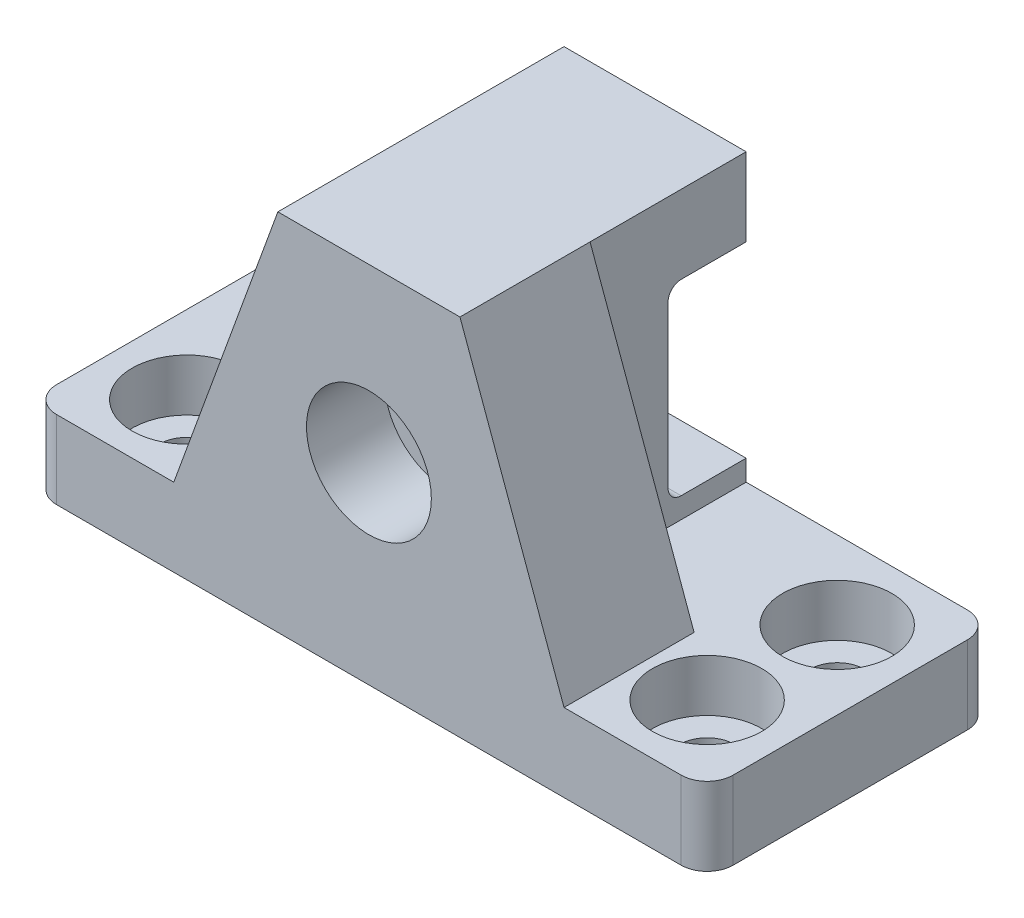
ISO-10303-21;
HEADER;
FILE_DESCRIPTION(('STEP AP214'),'2;1');
FILE_NAME('part.step','',(''),(''),'','','');
FILE_SCHEMA(('AUTOMOTIVE_DESIGN { 1 0 10303 214 1 1 1 1 }'));
ENDSEC;
DATA;
#1=APPLICATION_CONTEXT('core data for automotive mechanical design processes');
#2=APPLICATION_PROTOCOL_DEFINITION('international standard','automotive_design',2000,#1);
#3=PRODUCT_CONTEXT('',#1,'mechanical');
#4=PRODUCT('Part','Part','',(#3));
#5=PRODUCT_RELATED_PRODUCT_CATEGORY('part','',(#4));
#6=PRODUCT_DEFINITION_FORMATION('','',#4);
#7=PRODUCT_DEFINITION_CONTEXT('part definition',#1,'design');
#8=PRODUCT_DEFINITION('design','',#6,#7);
#9=PRODUCT_DEFINITION_SHAPE('','',#8);
#10=(LENGTH_UNIT() NAMED_UNIT(*) SI_UNIT(.MILLI.,.METRE.));
#11=(NAMED_UNIT(*) PLANE_ANGLE_UNIT() SI_UNIT($,.RADIAN.));
#12=(NAMED_UNIT(*) SI_UNIT($,.STERADIAN.) SOLID_ANGLE_UNIT());
#13=UNCERTAINTY_MEASURE_WITH_UNIT(LENGTH_MEASURE(1.E-05),#10,'distance_accuracy_value','');
#14=(GEOMETRIC_REPRESENTATION_CONTEXT(3) GLOBAL_UNCERTAINTY_ASSIGNED_CONTEXT((#13)) GLOBAL_UNIT_ASSIGNED_CONTEXT((#10,
#11,#12)) REPRESENTATION_CONTEXT('',''));
#15=CARTESIAN_POINT('',(0.,0.,0.));
#16=DIRECTION('',(0.,0.,1.));
#17=DIRECTION('',(1.,0.,0.));
#18=AXIS2_PLACEMENT_3D('',#15,#16,#17);
#19=CARTESIAN_POINT('',(-3.5,0.,21.1524758424985));
#20=DIRECTION('',(-1.,0.,0.));
#21=DIRECTION('',(0.,-1.,0.));
#22=AXIS2_PLACEMENT_3D('',#19,#20,#21);
#23=PLANE('',#22);
#24=DIRECTION('',(0.,0.,-1.));
#25=VECTOR('',#24,1.);
#26=CARTESIAN_POINT('',(-3.5,3.,0.));
#27=LINE('',#26,#25);
#28=CARTESIAN_POINT('',(-3.5,3.,0.5));
#29=VERTEX_POINT('',#28);
#30=CARTESIAN_POINT('',(-3.5,3.,-5.5));
#31=VERTEX_POINT('',#30);
#32=EDGE_CURVE('E194',#29,#31,#27,.T.);
#33=ORIENTED_EDGE('',*,*,#32,.F.);
#34=DIRECTION('',(0.,1.,0.));
#35=VECTOR('',#34,1.);
#36=CARTESIAN_POINT('',(-3.5,3.00000000000001,0.5));
#37=LINE('',#36,#35);
#38=CARTESIAN_POINT('',(-3.5,14.,0.5));
#39=VERTEX_POINT('',#38);
#40=EDGE_CURVE('E192',#29,#39,#37,.T.);
#41=ORIENTED_EDGE('',*,*,#40,.T.);
#42=DIRECTION('',(0.,0.,-1.));
#43=VECTOR('',#42,1.);
#44=CARTESIAN_POINT('',(-3.5,14.,21.1524758424985));
#45=LINE('',#44,#43);
#46=CARTESIAN_POINT('',(-3.5,14.,-5.5));
#47=VERTEX_POINT('',#46);
#48=EDGE_CURVE('E177',#39,#47,#45,.T.);
#49=ORIENTED_EDGE('',*,*,#48,.T.);
#50=DIRECTION('',(0.,1.,0.));
#51=VECTOR('',#50,1.);
#52=CARTESIAN_POINT('',(-3.5,0.,-5.5));
#53=LINE('',#52,#51);
#54=CARTESIAN_POINT('',(-3.5,11.,-5.5));
#55=VERTEX_POINT('',#54);
#56=EDGE_CURVE('E257',#55,#47,#53,.T.);
#57=ORIENTED_EDGE('',*,*,#56,.F.);
#58=DIRECTION('',(0.,0.,-1.));
#59=VECTOR('',#58,1.);
#60=CARTESIAN_POINT('',(-3.5,11.,21.1524758424985));
#61=LINE('',#60,#59);
#62=CARTESIAN_POINT('',(-3.5,11.,-3.));
#63=VERTEX_POINT('',#62);
#64=EDGE_CURVE('E320',#63,#55,#61,.T.);
#65=ORIENTED_EDGE('',*,*,#64,.F.);
#66=CARTESIAN_POINT('',(-3.5,10.5,-3.));
#67=DIRECTION('',(-1.,0.,0.));
#68=DIRECTION('',(0.,-1.,0.));
#69=AXIS2_PLACEMENT_3D('',#66,#67,#68);
#70=CIRCLE('',#69,0.5);
#71=CARTESIAN_POINT('',(-3.5,10.5,-2.5));
#72=VERTEX_POINT('',#71);
#73=EDGE_CURVE('E365',#63,#72,#70,.F.);
#74=ORIENTED_EDGE('',*,*,#73,.T.);
#75=DIRECTION('',(0.,1.,0.));
#76=VECTOR('',#75,1.);
#77=CARTESIAN_POINT('',(-3.5,0.,-2.5));
#78=LINE('',#77,#76);
#79=CARTESIAN_POINT('',(-3.5,4.3,-2.5));
#80=VERTEX_POINT('',#79);
#81=EDGE_CURVE('E341',#80,#72,#78,.T.);
#82=ORIENTED_EDGE('',*,*,#81,.F.);
#83=CARTESIAN_POINT('',(-3.5,4.3,-3.));
#84=DIRECTION('',(-1.,0.,0.));
#85=DIRECTION('',(0.,-1.,0.));
#86=AXIS2_PLACEMENT_3D('',#83,#84,#85);
#87=CIRCLE('',#86,0.5);
#88=CARTESIAN_POINT('',(-3.5,3.8,-3.));
#89=VERTEX_POINT('',#88);
#90=EDGE_CURVE('E361',#80,#89,#87,.F.);
#91=ORIENTED_EDGE('',*,*,#90,.T.);
#92=DIRECTION('',(0.,0.,1.));
#93=VECTOR('',#92,1.);
#94=CARTESIAN_POINT('',(-3.5,3.79999999999999,21.1524758424985));
#95=LINE('',#94,#93);
#96=CARTESIAN_POINT('',(-3.5,3.8,-5.5));
#97=VERTEX_POINT('',#96);
#98=EDGE_CURVE('E344',#97,#89,#95,.T.);
#99=ORIENTED_EDGE('',*,*,#98,.F.);
#100=EDGE_CURVE('E258',#31,#97,#53,.T.);
#101=ORIENTED_EDGE('',*,*,#100,.F.);
#102=EDGE_LOOP('',(#33,#41,#49,#57,#65,#74,#82,#91,#99,#101));
#103=FACE_BOUND('',#102,.T.);
#104=ADVANCED_FACE('F37',(#103),#23,.T.);
#105=CARTESIAN_POINT('',(0.,7.4,5.5));
#106=DIRECTION('',(0.,0.,-1.));
#107=DIRECTION('',(0.,1.,0.));
#108=AXIS2_PLACEMENT_3D('',#105,#106,#107);
#109=CYLINDRICAL_SURFACE('',#108,1.35);
#110=CARTESIAN_POINT('',(0.,7.4,-2.5));
#111=DIRECTION('',(0.,0.,-1.));
#112=DIRECTION('',(0.,1.,0.));
#113=AXIS2_PLACEMENT_3D('',#110,#111,#112);
#114=CIRCLE('',#113,1.35);
#115=CARTESIAN_POINT('',(0.,8.75,-2.5));
#116=VERTEX_POINT('',#115);
#117=EDGE_CURVE('E234',#116,#116,#114,.T.);
#118=ORIENTED_EDGE('',*,*,#117,.T.);
#119=EDGE_LOOP('',(#118));
#120=FACE_BOUND('',#119,.T.);
#121=CARTESIAN_POINT('',(0.,7.4,2.5));
#122=DIRECTION('',(0.,0.,1.));
#123=DIRECTION('',(0.,-1.,0.));
#124=AXIS2_PLACEMENT_3D('',#121,#122,#123);
#125=CIRCLE('',#124,1.35);
#126=CARTESIAN_POINT('',(0.,6.05,2.5));
#127=VERTEX_POINT('',#126);
#128=EDGE_CURVE('E233',#127,#127,#125,.F.);
#129=ORIENTED_EDGE('',*,*,#128,.F.);
#130=EDGE_LOOP('',(#129));
#131=FACE_BOUND('',#130,.T.);
#132=ADVANCED_FACE('F497',(#120,#131),#109,.F.);
#133=CARTESIAN_POINT('',(-13.,3.,-5.5));
#134=DIRECTION('',(0.,0.,1.));
#135=DIRECTION('',(1.,0.,0.));
#136=AXIS2_PLACEMENT_3D('',#133,#134,#135);
#137=PLANE('',#136);
#138=DIRECTION('',(-1.,0.,0.));
#139=VECTOR('',#138,1.);
#140=CARTESIAN_POINT('',(-13.,0.,-5.5));
#141=LINE('',#140,#139);
#142=CARTESIAN_POINT('',(12.,0.,-5.5));
#143=VERTEX_POINT('',#142);
#144=CARTESIAN_POINT('',(-12.,0.,-5.5));
#145=VERTEX_POINT('',#144);
#146=EDGE_CURVE('E323',#143,#145,#141,.T.);
#147=ORIENTED_EDGE('',*,*,#146,.T.);
#148=DIRECTION('',(0.,-1.,0.));
#149=VECTOR('',#148,1.);
#150=CARTESIAN_POINT('',(-12.,3.,-5.5));
#151=LINE('',#150,#149);
#152=CARTESIAN_POINT('',(-12.,3.,-5.5));
#153=VERTEX_POINT('',#152);
#154=EDGE_CURVE('E383',#145,#153,#151,.F.);
#155=ORIENTED_EDGE('',*,*,#154,.T.);
#156=DIRECTION('',(-1.,0.,0.));
#157=VECTOR('',#156,1.);
#158=CARTESIAN_POINT('',(-13.,3.,-5.5));
#159=LINE('',#158,#157);
#160=EDGE_CURVE('E311',#31,#153,#159,.T.);
#161=ORIENTED_EDGE('',*,*,#160,.F.);
#162=ORIENTED_EDGE('',*,*,#100,.T.);
#163=DIRECTION('',(1.,0.,0.));
#164=VECTOR('',#163,1.);
#165=CARTESIAN_POINT('',(-13.,3.8,-5.5));
#166=LINE('',#165,#164);
#167=CARTESIAN_POINT('',(3.5,3.8,-5.5));
#168=VERTEX_POINT('',#167);
#169=EDGE_CURVE('E246',#97,#168,#166,.T.);
#170=ORIENTED_EDGE('',*,*,#169,.T.);
#171=DIRECTION('',(0.,-1.,0.));
#172=VECTOR('',#171,1.);
#173=CARTESIAN_POINT('',(3.5,0.,-5.5));
#174=LINE('',#173,#172);
#175=CARTESIAN_POINT('',(3.49999999999999,3.,-5.5));
#176=VERTEX_POINT('',#175);
#177=EDGE_CURVE('E249',#168,#176,#174,.T.);
#178=ORIENTED_EDGE('',*,*,#177,.T.);
#179=CARTESIAN_POINT('',(12.,3.,-5.5));
#180=VERTEX_POINT('',#179);
#181=EDGE_CURVE('E313',#180,#176,#159,.T.);
#182=ORIENTED_EDGE('',*,*,#181,.F.);
#183=DIRECTION('',(0.,-1.,0.));
#184=VECTOR('',#183,1.);
#185=CARTESIAN_POINT('',(12.,3.,-5.5));
#186=LINE('',#185,#184);
#187=EDGE_CURVE('E380',#180,#143,#186,.T.);
#188=ORIENTED_EDGE('',*,*,#187,.T.);
#189=EDGE_LOOP('',(#147,#155,#161,#162,#170,#178,#182,#188));
#190=FACE_BOUND('',#189,.T.);
#191=ADVANCED_FACE('F435',(#190),#137,.F.);
#192=CARTESIAN_POINT('',(0.,3.,0.));
#193=DIRECTION('',(0.,-1.,0.));
#194=DIRECTION('',(0.,0.,-1.));
#195=AXIS2_PLACEMENT_3D('',#192,#193,#194);
#196=PLANE('',#195);
#197=CARTESIAN_POINT('',(10.,3.,2.5));
#198=DIRECTION('',(0.,1.,0.));
#199=DIRECTION('',(0.,0.,1.));
#200=AXIS2_PLACEMENT_3D('',#197,#198,#199);
#201=CIRCLE('',#200,2.1);
#202=CARTESIAN_POINT('',(10.,3.,4.6));
#203=VERTEX_POINT('',#202);
#204=EDGE_CURVE('E268',#203,#203,#201,.T.);
#205=ORIENTED_EDGE('',*,*,#204,.F.);
#206=EDGE_LOOP('',(#205));
#207=FACE_BOUND('',#206,.T.);
#208=CARTESIAN_POINT('',(10.,3.,-2.5));
#209=DIRECTION('',(0.,1.,0.));
#210=DIRECTION('',(0.,0.,1.));
#211=AXIS2_PLACEMENT_3D('',#208,#209,#210);
#212=CIRCLE('',#211,2.1);
#213=CARTESIAN_POINT('',(10.,3.,-0.399999999999999));
#214=VERTEX_POINT('',#213);
#215=EDGE_CURVE('E279',#214,#214,#212,.T.);
#216=ORIENTED_EDGE('',*,*,#215,.F.);
#217=EDGE_LOOP('',(#216));
#218=FACE_BOUND('',#217,.T.);
#219=DIRECTION('',(1.,0.,0.));
#220=VECTOR('',#219,1.);
#221=CARTESIAN_POINT('',(7.5,3.,0.5));
#222=LINE('',#221,#220);
#223=CARTESIAN_POINT('',(3.5,3.,0.5));
#224=VERTEX_POINT('',#223);
#225=CARTESIAN_POINT('',(7.5,3.,0.5));
#226=VERTEX_POINT('',#225);
#227=EDGE_CURVE('E213',#224,#226,#222,.T.);
#228=ORIENTED_EDGE('',*,*,#227,.T.);
#229=DIRECTION('',(0.,0.,1.));
#230=VECTOR('',#229,1.);
#231=CARTESIAN_POINT('',(7.5,3.,0.5));
#232=LINE('',#231,#230);
#233=CARTESIAN_POINT('',(7.5,3.,5.5));
#234=VERTEX_POINT('',#233);
#235=EDGE_CURVE('E222',#226,#234,#232,.T.);
#236=ORIENTED_EDGE('',*,*,#235,.T.);
#237=DIRECTION('',(1.,0.,0.));
#238=VECTOR('',#237,1.);
#239=CARTESIAN_POINT('',(-13.,3.,5.5));
#240=LINE('',#239,#238);
#241=CARTESIAN_POINT('',(12.,3.,5.5));
#242=VERTEX_POINT('',#241);
#243=EDGE_CURVE('E318',#234,#242,#240,.T.);
#244=ORIENTED_EDGE('',*,*,#243,.T.);
#245=CARTESIAN_POINT('',(12.,3.,4.5));
#246=DIRECTION('',(0.,-1.,0.));
#247=DIRECTION('',(0.,0.,-1.));
#248=AXIS2_PLACEMENT_3D('',#245,#246,#247);
#249=CIRCLE('',#248,1.);
#250=CARTESIAN_POINT('',(13.,3.,4.5));
#251=VERTEX_POINT('',#250);
#252=EDGE_CURVE('E45',#242,#251,#249,.F.);
#253=ORIENTED_EDGE('',*,*,#252,.T.);
#254=DIRECTION('',(0.,0.,-1.));
#255=VECTOR('',#254,1.);
#256=CARTESIAN_POINT('',(13.,3.,5.5));
#257=LINE('',#256,#255);
#258=CARTESIAN_POINT('',(13.,3.,-4.5));
#259=VERTEX_POINT('',#258);
#260=EDGE_CURVE('E308',#251,#259,#257,.T.);
#261=ORIENTED_EDGE('',*,*,#260,.T.);
#262=CARTESIAN_POINT('',(12.,3.,-4.5));
#263=DIRECTION('',(0.,-1.,0.));
#264=DIRECTION('',(0.,0.,-1.));
#265=AXIS2_PLACEMENT_3D('',#262,#263,#264);
#266=CIRCLE('',#265,1.);
#267=EDGE_CURVE('E12',#259,#180,#266,.F.);
#268=ORIENTED_EDGE('',*,*,#267,.T.);
#269=ORIENTED_EDGE('',*,*,#181,.T.);
#270=DIRECTION('',(0.,0.,1.));
#271=VECTOR('',#270,1.);
#272=CARTESIAN_POINT('',(3.5,3.,0.));
#273=LINE('',#272,#271);
#274=EDGE_CURVE('E265',#176,#224,#273,.T.);
#275=ORIENTED_EDGE('',*,*,#274,.T.);
#276=EDGE_LOOP('',(#228,#236,#244,#253,#261,#268,#269,#275));
#277=FACE_BOUND('',#276,.T.);
#278=ADVANCED_FACE('F402',(#207,#218,#277),#196,.F.);
#279=CARTESIAN_POINT('',(-10.,3.,2.5));
#280=DIRECTION('',(0.,-1.,0.));
#281=DIRECTION('',(0.,0.,-1.));
#282=AXIS2_PLACEMENT_3D('',#279,#280,#281);
#283=CYLINDRICAL_SURFACE('',#282,1.05);
#284=CARTESIAN_POINT('',(-10.,0.,2.5));
#285=DIRECTION('',(0.,1.,0.));
#286=DIRECTION('',(0.,0.,1.));
#287=AXIS2_PLACEMENT_3D('',#284,#285,#286);
#288=CIRCLE('',#287,1.05);
#289=CARTESIAN_POINT('',(-10.,0.,3.55));
#290=VERTEX_POINT('',#289);
#291=EDGE_CURVE('E301',#290,#290,#288,.T.);
#292=ORIENTED_EDGE('',*,*,#291,.F.);
#293=EDGE_LOOP('',(#292));
#294=FACE_BOUND('',#293,.T.);
#295=CARTESIAN_POINT('',(-10.,1.,2.5));
#296=DIRECTION('',(0.,1.,0.));
#297=DIRECTION('',(0.,0.,1.));
#298=AXIS2_PLACEMENT_3D('',#295,#296,#297);
#299=CIRCLE('',#298,1.05);
#300=CARTESIAN_POINT('',(-10.,1.,3.55));
#301=VERTEX_POINT('',#300);
#302=EDGE_CURVE('E294',#301,#301,#299,.T.);
#303=ORIENTED_EDGE('',*,*,#302,.T.);
#304=EDGE_LOOP('',(#303));
#305=FACE_BOUND('',#304,.T.);
#306=ADVANCED_FACE('F494',(#294,#305),#283,.F.);
#307=CARTESIAN_POINT('',(10.,3.,-2.5));
#308=DIRECTION('',(0.,-1.,0.));
#309=DIRECTION('',(0.,0.,-1.));
#310=AXIS2_PLACEMENT_3D('',#307,#308,#309);
#311=CYLINDRICAL_SURFACE('',#310,1.05);
#312=CARTESIAN_POINT('',(10.,0.,-2.5));
#313=DIRECTION('',(0.,1.,0.));
#314=DIRECTION('',(0.,0.,1.));
#315=AXIS2_PLACEMENT_3D('',#312,#313,#314);
#316=CIRCLE('',#315,1.05);
#317=CARTESIAN_POINT('',(10.,0.,-1.45));
#318=VERTEX_POINT('',#317);
#319=EDGE_CURVE('E298',#318,#318,#316,.T.);
#320=ORIENTED_EDGE('',*,*,#319,.F.);
#321=EDGE_LOOP('',(#320));
#322=FACE_BOUND('',#321,.T.);
#323=CARTESIAN_POINT('',(10.,1.,-2.5));
#324=DIRECTION('',(0.,1.,0.));
#325=DIRECTION('',(0.,0.,1.));
#326=AXIS2_PLACEMENT_3D('',#323,#324,#325);
#327=CIRCLE('',#326,1.05);
#328=CARTESIAN_POINT('',(10.,1.,-1.45));
#329=VERTEX_POINT('',#328);
#330=EDGE_CURVE('E335',#329,#329,#327,.T.);
#331=ORIENTED_EDGE('',*,*,#330,.T.);
#332=EDGE_LOOP('',(#331));
#333=FACE_BOUND('',#332,.T.);
#334=ADVANCED_FACE('F543',(#322,#333),#311,.F.);
#335=CARTESIAN_POINT('',(10.,3.,2.5));
#336=DIRECTION('',(0.,-1.,0.));
#337=DIRECTION('',(0.,0.,-1.));
#338=AXIS2_PLACEMENT_3D('',#335,#336,#337);
#339=CYLINDRICAL_SURFACE('',#338,1.05);
#340=CARTESIAN_POINT('',(10.,0.,2.5));
#341=DIRECTION('',(0.,1.,0.));
#342=DIRECTION('',(0.,0.,1.));
#343=AXIS2_PLACEMENT_3D('',#340,#341,#342);
#344=CIRCLE('',#343,1.05);
#345=CARTESIAN_POINT('',(10.,0.,3.55));
#346=VERTEX_POINT('',#345);
#347=EDGE_CURVE('E295',#346,#346,#344,.T.);
#348=ORIENTED_EDGE('',*,*,#347,.F.);
#349=EDGE_LOOP('',(#348));
#350=FACE_BOUND('',#349,.T.);
#351=CARTESIAN_POINT('',(10.,1.,2.5));
#352=DIRECTION('',(0.,1.,0.));
#353=DIRECTION('',(0.,0.,1.));
#354=AXIS2_PLACEMENT_3D('',#351,#352,#353);
#355=CIRCLE('',#354,1.05);
#356=CARTESIAN_POINT('',(10.,1.,3.55));
#357=VERTEX_POINT('',#356);
#358=EDGE_CURVE('E272',#357,#357,#355,.T.);
#359=ORIENTED_EDGE('',*,*,#358,.T.);
#360=EDGE_LOOP('',(#359));
#361=FACE_BOUND('',#360,.T.);
#362=ADVANCED_FACE('F488',(#350,#361),#339,.F.);
#363=CARTESIAN_POINT('',(-10.,3.,-2.5));
#364=DIRECTION('',(0.,-1.,0.));
#365=DIRECTION('',(0.,0.,-1.));
#366=AXIS2_PLACEMENT_3D('',#363,#364,#365);
#367=CYLINDRICAL_SURFACE('',#366,1.05);
#368=CARTESIAN_POINT('',(-10.,0.,-2.5));
#369=DIRECTION('',(0.,1.,0.));
#370=DIRECTION('',(0.,0.,1.));
#371=AXIS2_PLACEMENT_3D('',#368,#369,#370);
#372=CIRCLE('',#371,1.05);
#373=CARTESIAN_POINT('',(-10.,0.,-1.45));
#374=VERTEX_POINT('',#373);
#375=EDGE_CURVE('E304',#374,#374,#372,.T.);
#376=ORIENTED_EDGE('',*,*,#375,.F.);
#377=EDGE_LOOP('',(#376));
#378=FACE_BOUND('',#377,.T.);
#379=CARTESIAN_POINT('',(-10.,1.,-2.5));
#380=DIRECTION('',(0.,1.,0.));
#381=DIRECTION('',(0.,0.,1.));
#382=AXIS2_PLACEMENT_3D('',#379,#380,#381);
#383=CIRCLE('',#382,1.05);
#384=CARTESIAN_POINT('',(-10.,1.,-1.45));
#385=VERTEX_POINT('',#384);
#386=EDGE_CURVE('E290',#385,#385,#383,.T.);
#387=ORIENTED_EDGE('',*,*,#386,.T.);
#388=EDGE_LOOP('',(#387));
#389=FACE_BOUND('',#388,.T.);
#390=ADVANCED_FACE('F480',(#378,#389),#367,.F.);
#391=CARTESIAN_POINT('',(-10.,3.,2.5));
#392=DIRECTION('',(0.,1.,0.));
#393=DIRECTION('',(0.,0.,1.));
#394=AXIS2_PLACEMENT_3D('',#391,#392,#393);
#395=CIRCLE('',#394,2.1);
#396=CARTESIAN_POINT('',(-10.,3.,4.6));
#397=VERTEX_POINT('',#396);
#398=EDGE_CURVE('E273',#397,#397,#395,.T.);
#399=ORIENTED_EDGE('',*,*,#398,.F.);
#400=EDGE_LOOP('',(#399));
#401=FACE_BOUND('',#400,.T.);
#402=CARTESIAN_POINT('',(-10.,3.,-2.5));
#403=DIRECTION('',(0.,1.,0.));
#404=DIRECTION('',(0.,0.,1.));
#405=AXIS2_PLACEMENT_3D('',#402,#403,#404);
#406=CIRCLE('',#405,2.1);
#407=CARTESIAN_POINT('',(-10.,3.,-0.399999999999999));
#408=VERTEX_POINT('',#407);
#409=EDGE_CURVE('E291',#408,#408,#406,.T.);
#410=ORIENTED_EDGE('',*,*,#409,.F.);
#411=EDGE_LOOP('',(#410));
#412=FACE_BOUND('',#411,.T.);
#413=CARTESIAN_POINT('',(-12.,3.,5.5));
#414=VERTEX_POINT('',#413);
#415=CARTESIAN_POINT('',(-7.5,3.,5.5));
#416=VERTEX_POINT('',#415);
#417=EDGE_CURVE('E57',#414,#416,#240,.T.);
#418=ORIENTED_EDGE('',*,*,#417,.T.);
#419=DIRECTION('',(0.,0.,1.));
#420=VECTOR('',#419,1.);
#421=CARTESIAN_POINT('',(-7.5,3.00000000000001,0.5));
#422=LINE('',#421,#420);
#423=CARTESIAN_POINT('',(-7.5,3.,0.5));
#424=VERTEX_POINT('',#423);
#425=EDGE_CURVE('E52',#424,#416,#422,.T.);
#426=ORIENTED_EDGE('',*,*,#425,.F.);
#427=DIRECTION('',(1.,0.,0.));
#428=VECTOR('',#427,1.);
#429=CARTESIAN_POINT('',(-7.5,3.00000000000001,0.5));
#430=LINE('',#429,#428);
#431=EDGE_CURVE('E197',#424,#29,#430,.T.);
#432=ORIENTED_EDGE('',*,*,#431,.T.);
#433=ORIENTED_EDGE('',*,*,#32,.T.);
#434=ORIENTED_EDGE('',*,*,#160,.T.);
#435=CARTESIAN_POINT('',(-12.,3.,-4.5));
#436=DIRECTION('',(0.,-1.,0.));
#437=DIRECTION('',(0.,0.,-1.));
#438=AXIS2_PLACEMENT_3D('',#435,#436,#437);
#439=CIRCLE('',#438,1.);
#440=CARTESIAN_POINT('',(-13.,3.,-4.5));
#441=VERTEX_POINT('',#440);
#442=EDGE_CURVE('E387',#153,#441,#439,.F.);
#443=ORIENTED_EDGE('',*,*,#442,.T.);
#444=DIRECTION('',(0.,0.,1.));
#445=VECTOR('',#444,1.);
#446=CARTESIAN_POINT('',(-13.,3.,5.5));
#447=LINE('',#446,#445);
#448=CARTESIAN_POINT('',(-13.,3.,4.5));
#449=VERTEX_POINT('',#448);
#450=EDGE_CURVE('E315',#441,#449,#447,.T.);
#451=ORIENTED_EDGE('',*,*,#450,.T.);
#452=CARTESIAN_POINT('',(-12.,3.,4.5));
#453=DIRECTION('',(0.,-1.,0.));
#454=DIRECTION('',(0.,0.,-1.));
#455=AXIS2_PLACEMENT_3D('',#452,#453,#454);
#456=CIRCLE('',#455,1.);
#457=EDGE_CURVE('E385',#449,#414,#456,.F.);
#458=ORIENTED_EDGE('',*,*,#457,.T.);
#459=EDGE_LOOP('',(#418,#426,#432,#433,#434,#443,#451,#458));
#460=FACE_BOUND('',#459,.T.);
#461=ADVANCED_FACE('F478',(#401,#412,#460),#196,.F.);
#462=CARTESIAN_POINT('',(0.,0.,0.));
#463=DIRECTION('',(0.,-1.,0.));
#464=DIRECTION('',(0.,0.,-1.));
#465=AXIS2_PLACEMENT_3D('',#462,#463,#464);
#466=PLANE('',#465);
#467=DIRECTION('',(0.,0.,1.));
#468=VECTOR('',#467,1.);
#469=CARTESIAN_POINT('',(-13.,0.,5.5));
#470=LINE('',#469,#468);
#471=CARTESIAN_POINT('',(-13.,0.,-4.5));
#472=VERTEX_POINT('',#471);
#473=CARTESIAN_POINT('',(-13.,0.,4.5));
#474=VERTEX_POINT('',#473);
#475=EDGE_CURVE('E326',#472,#474,#470,.T.);
#476=ORIENTED_EDGE('',*,*,#475,.F.);
#477=CARTESIAN_POINT('',(-12.,0.,-4.5));
#478=DIRECTION('',(0.,-1.,0.));
#479=DIRECTION('',(0.,0.,-1.));
#480=AXIS2_PLACEMENT_3D('',#477,#478,#479);
#481=CIRCLE('',#480,1.);
#482=EDGE_CURVE('E378',#472,#145,#481,.T.);
#483=ORIENTED_EDGE('',*,*,#482,.T.);
#484=ORIENTED_EDGE('',*,*,#146,.F.);
#485=CARTESIAN_POINT('',(12.,0.,-4.5));
#486=DIRECTION('',(0.,-1.,0.));
#487=DIRECTION('',(0.,0.,-1.));
#488=AXIS2_PLACEMENT_3D('',#485,#486,#487);
#489=CIRCLE('',#488,1.);
#490=CARTESIAN_POINT('',(13.,0.,-4.5));
#491=VERTEX_POINT('',#490);
#492=EDGE_CURVE('E374',#143,#491,#489,.T.);
#493=ORIENTED_EDGE('',*,*,#492,.T.);
#494=DIRECTION('',(0.,0.,-1.));
#495=VECTOR('',#494,1.);
#496=CARTESIAN_POINT('',(13.,0.,5.5));
#497=LINE('',#496,#495);
#498=CARTESIAN_POINT('',(13.,0.,4.5));
#499=VERTEX_POINT('',#498);
#500=EDGE_CURVE('E307',#499,#491,#497,.T.);
#501=ORIENTED_EDGE('',*,*,#500,.F.);
#502=CARTESIAN_POINT('',(12.,0.,4.5));
#503=DIRECTION('',(0.,-1.,0.));
#504=DIRECTION('',(0.,0.,-1.));
#505=AXIS2_PLACEMENT_3D('',#502,#503,#504);
#506=CIRCLE('',#505,1.);
#507=CARTESIAN_POINT('',(12.,0.,5.5));
#508=VERTEX_POINT('',#507);
#509=EDGE_CURVE('E372',#499,#508,#506,.T.);
#510=ORIENTED_EDGE('',*,*,#509,.T.);
#511=DIRECTION('',(1.,0.,0.));
#512=VECTOR('',#511,1.);
#513=CARTESIAN_POINT('',(-13.,0.,5.5));
#514=LINE('',#513,#512);
#515=CARTESIAN_POINT('',(-12.,0.,5.5));
#516=VERTEX_POINT('',#515);
#517=EDGE_CURVE('E312',#516,#508,#514,.T.);
#518=ORIENTED_EDGE('',*,*,#517,.F.);
#519=CARTESIAN_POINT('',(-12.,0.,4.5));
#520=DIRECTION('',(0.,-1.,0.));
#521=DIRECTION('',(0.,0.,-1.));
#522=AXIS2_PLACEMENT_3D('',#519,#520,#521);
#523=CIRCLE('',#522,1.);
#524=EDGE_CURVE('E376',#516,#474,#523,.T.);
#525=ORIENTED_EDGE('',*,*,#524,.T.);
#526=EDGE_LOOP('',(#476,#483,#484,#493,#501,#510,#518,#525));
#527=FACE_BOUND('',#526,.T.);
#528=ORIENTED_EDGE('',*,*,#375,.T.);
#529=EDGE_LOOP('',(#528));
#530=FACE_BOUND('',#529,.T.);
#531=ORIENTED_EDGE('',*,*,#291,.T.);
#532=EDGE_LOOP('',(#531));
#533=FACE_BOUND('',#532,.T.);
#534=ORIENTED_EDGE('',*,*,#347,.T.);
#535=EDGE_LOOP('',(#534));
#536=FACE_BOUND('',#535,.T.);
#537=ORIENTED_EDGE('',*,*,#319,.T.);
#538=EDGE_LOOP('',(#537));
#539=FACE_BOUND('',#538,.T.);
#540=ADVANCED_FACE('F415',(#527,#530,#533,#536,#539),#466,.T.);
#541=CARTESIAN_POINT('',(13.,3.,5.5));
#542=DIRECTION('',(-1.,0.,0.));
#543=DIRECTION('',(0.,0.,1.));
#544=AXIS2_PLACEMENT_3D('',#541,#542,#543);
#545=PLANE('',#544);
#546=ORIENTED_EDGE('',*,*,#500,.T.);
#547=DIRECTION('',(0.,-1.,0.));
#548=VECTOR('',#547,1.);
#549=CARTESIAN_POINT('',(13.,3.,-4.5));
#550=LINE('',#549,#548);
#551=EDGE_CURVE('E398',#491,#259,#550,.F.);
#552=ORIENTED_EDGE('',*,*,#551,.T.);
#553=ORIENTED_EDGE('',*,*,#260,.F.);
#554=DIRECTION('',(0.,-1.,0.));
#555=VECTOR('',#554,1.);
#556=CARTESIAN_POINT('',(13.,3.,4.5));
#557=LINE('',#556,#555);
#558=EDGE_CURVE('E395',#251,#499,#557,.T.);
#559=ORIENTED_EDGE('',*,*,#558,.T.);
#560=EDGE_LOOP('',(#546,#552,#553,#559));
#561=FACE_BOUND('',#560,.T.);
#562=ADVANCED_FACE('F409',(#561),#545,.F.);
#563=CARTESIAN_POINT('',(3.5,14.,-5.5));
#564=VERTEX_POINT('',#563);
#565=CARTESIAN_POINT('',(3.5,11.,-5.5));
#566=VERTEX_POINT('',#565);
#567=EDGE_CURVE('E254',#564,#566,#174,.T.);
#568=ORIENTED_EDGE('',*,*,#567,.T.);
#569=DIRECTION('',(1.,0.,0.));
#570=VECTOR('',#569,1.);
#571=CARTESIAN_POINT('',(-13.,11.,-5.5));
#572=LINE('',#571,#570);
#573=EDGE_CURVE('E245',#55,#566,#572,.T.);
#574=ORIENTED_EDGE('',*,*,#573,.F.);
#575=ORIENTED_EDGE('',*,*,#56,.T.);
#576=DIRECTION('',(1.,0.,0.));
#577=VECTOR('',#576,1.);
#578=CARTESIAN_POINT('',(3.5,14.,-5.5));
#579=LINE('',#578,#577);
#580=EDGE_CURVE('E185',#47,#564,#579,.T.);
#581=ORIENTED_EDGE('',*,*,#580,.T.);
#582=EDGE_LOOP('',(#568,#574,#575,#581));
#583=FACE_BOUND('',#582,.T.);
#584=ADVANCED_FACE('F458',(#583),#137,.F.);
#585=CARTESIAN_POINT('',(-13.,3.,5.5));
#586=DIRECTION('',(1.,0.,0.));
#587=DIRECTION('',(0.,0.,-1.));
#588=AXIS2_PLACEMENT_3D('',#585,#586,#587);
#589=PLANE('',#588);
#590=ORIENTED_EDGE('',*,*,#450,.F.);
#591=DIRECTION('',(0.,-1.,0.));
#592=VECTOR('',#591,1.);
#593=CARTESIAN_POINT('',(-13.,3.,-4.5));
#594=LINE('',#593,#592);
#595=EDGE_CURVE('E369',#441,#472,#594,.T.);
#596=ORIENTED_EDGE('',*,*,#595,.T.);
#597=ORIENTED_EDGE('',*,*,#475,.T.);
#598=DIRECTION('',(0.,-1.,0.));
#599=VECTOR('',#598,1.);
#600=CARTESIAN_POINT('',(-13.,3.,4.5));
#601=LINE('',#600,#599);
#602=EDGE_CURVE('E367',#474,#449,#601,.F.);
#603=ORIENTED_EDGE('',*,*,#602,.T.);
#604=EDGE_LOOP('',(#590,#596,#597,#603));
#605=FACE_BOUND('',#604,.T.);
#606=ADVANCED_FACE('F427',(#605),#589,.F.);
#607=CARTESIAN_POINT('',(-13.,3.,5.5));
#608=DIRECTION('',(0.,0.,-1.));
#609=DIRECTION('',(-1.,0.,0.));
#610=AXIS2_PLACEMENT_3D('',#607,#608,#609);
#611=PLANE('',#610);
#612=ORIENTED_EDGE('',*,*,#243,.F.);
#613=DIRECTION('',(-0.341743063086704,0.939793423488437,0.));
#614=VECTOR('',#613,1.);
#615=CARTESIAN_POINT('',(3.5,14.,5.5));
#616=LINE('',#615,#614);
#617=CARTESIAN_POINT('',(3.5,14.,5.5));
#618=VERTEX_POINT('',#617);
#619=EDGE_CURVE('E212',#234,#618,#616,.T.);
#620=ORIENTED_EDGE('',*,*,#619,.T.);
#621=DIRECTION('',(-1.,0.,0.));
#622=VECTOR('',#621,1.);
#623=CARTESIAN_POINT('',(3.5,14.,5.5));
#624=LINE('',#623,#622);
#625=CARTESIAN_POINT('',(-3.5,14.,5.5));
#626=VERTEX_POINT('',#625);
#627=EDGE_CURVE('E251',#618,#626,#624,.T.);
#628=ORIENTED_EDGE('',*,*,#627,.T.);
#629=DIRECTION('',(-0.341743063086705,-0.939793423488437,0.));
#630=VECTOR('',#629,1.);
#631=CARTESIAN_POINT('',(-3.5,14.,5.5));
#632=LINE('',#631,#630);
#633=EDGE_CURVE('E204',#626,#416,#632,.T.);
#634=ORIENTED_EDGE('',*,*,#633,.T.);
#635=ORIENTED_EDGE('',*,*,#417,.F.);
#636=DIRECTION('',(0.,-1.,0.));
#637=VECTOR('',#636,1.);
#638=CARTESIAN_POINT('',(-12.,3.,5.5));
#639=LINE('',#638,#637);
#640=EDGE_CURVE('E392',#414,#516,#639,.T.);
#641=ORIENTED_EDGE('',*,*,#640,.T.);
#642=ORIENTED_EDGE('',*,*,#517,.T.);
#643=DIRECTION('',(0.,-1.,0.));
#644=VECTOR('',#643,1.);
#645=CARTESIAN_POINT('',(12.,3.,5.5));
#646=LINE('',#645,#644);
#647=EDGE_CURVE('E389',#508,#242,#646,.F.);
#648=ORIENTED_EDGE('',*,*,#647,.T.);
#649=EDGE_LOOP('',(#612,#620,#628,#634,#635,#641,#642,#648));
#650=FACE_BOUND('',#649,.T.);
#651=CARTESIAN_POINT('',(0.,7.4,5.5));
#652=DIRECTION('',(0.,0.,1.));
#653=DIRECTION('',(1.,0.,0.));
#654=AXIS2_PLACEMENT_3D('',#651,#652,#653);
#655=CIRCLE('',#654,2.4);
#656=CARTESIAN_POINT('',(2.4,7.4,5.5));
#657=VERTEX_POINT('',#656);
#658=EDGE_CURVE('E227',#657,#657,#655,.T.);
#659=ORIENTED_EDGE('',*,*,#658,.F.);
#660=EDGE_LOOP('',(#659));
#661=FACE_BOUND('',#660,.T.);
#662=ADVANCED_FACE('F418',(#650,#661),#611,.F.);
#663=CARTESIAN_POINT('',(-10.,1.,-2.5));
#664=DIRECTION('',(0.,1.,0.));
#665=DIRECTION('',(0.,0.,1.));
#666=AXIS2_PLACEMENT_3D('',#663,#664,#665);
#667=CYLINDRICAL_SURFACE('',#666,2.1);
#668=CARTESIAN_POINT('',(-10.,1.,-2.5));
#669=DIRECTION('',(0.,1.,0.));
#670=DIRECTION('',(0.,0.,1.));
#671=AXIS2_PLACEMENT_3D('',#668,#669,#670);
#672=CIRCLE('',#671,2.1);
#673=CARTESIAN_POINT('',(-10.,1.,-0.399999999999999));
#674=VERTEX_POINT('',#673);
#675=EDGE_CURVE('E287',#674,#674,#672,.T.);
#676=ORIENTED_EDGE('',*,*,#675,.F.);
#677=EDGE_LOOP('',(#676));
#678=FACE_BOUND('',#677,.T.);
#679=ORIENTED_EDGE('',*,*,#409,.T.);
#680=EDGE_LOOP('',(#679));
#681=FACE_BOUND('',#680,.T.);
#682=ADVANCED_FACE('F536',(#678,#681),#667,.F.);
#683=CARTESIAN_POINT('',(-10.,1.,-2.5));
#684=DIRECTION('',(0.,1.,0.));
#685=DIRECTION('',(0.,0.,1.));
#686=AXIS2_PLACEMENT_3D('',#683,#684,#685);
#687=PLANE('',#686);
#688=ORIENTED_EDGE('',*,*,#386,.F.);
#689=EDGE_LOOP('',(#688));
#690=FACE_BOUND('',#689,.T.);
#691=ORIENTED_EDGE('',*,*,#675,.T.);
#692=EDGE_LOOP('',(#691));
#693=FACE_BOUND('',#692,.T.);
#694=ADVANCED_FACE('F532',(#690,#693),#687,.T.);
#695=CARTESIAN_POINT('',(10.,1.,2.5));
#696=DIRECTION('',(0.,1.,0.));
#697=DIRECTION('',(0.,0.,1.));
#698=AXIS2_PLACEMENT_3D('',#695,#696,#697);
#699=CYLINDRICAL_SURFACE('',#698,2.1);
#700=CARTESIAN_POINT('',(10.,1.,2.5));
#701=DIRECTION('',(0.,1.,0.));
#702=DIRECTION('',(0.,0.,1.));
#703=AXIS2_PLACEMENT_3D('',#700,#701,#702);
#704=CIRCLE('',#703,2.1);
#705=CARTESIAN_POINT('',(10.,1.,4.6));
#706=VERTEX_POINT('',#705);
#707=EDGE_CURVE('E282',#706,#706,#704,.T.);
#708=ORIENTED_EDGE('',*,*,#707,.F.);
#709=EDGE_LOOP('',(#708));
#710=FACE_BOUND('',#709,.T.);
#711=ORIENTED_EDGE('',*,*,#204,.T.);
#712=EDGE_LOOP('',(#711));
#713=FACE_BOUND('',#712,.T.);
#714=ADVANCED_FACE('F528',(#710,#713),#699,.F.);
#715=CARTESIAN_POINT('',(10.,1.,2.5));
#716=DIRECTION('',(0.,1.,0.));
#717=DIRECTION('',(0.,0.,1.));
#718=AXIS2_PLACEMENT_3D('',#715,#716,#717);
#719=PLANE('',#718);
#720=ORIENTED_EDGE('',*,*,#358,.F.);
#721=EDGE_LOOP('',(#720));
#722=FACE_BOUND('',#721,.T.);
#723=ORIENTED_EDGE('',*,*,#707,.T.);
#724=EDGE_LOOP('',(#723));
#725=FACE_BOUND('',#724,.T.);
#726=ADVANCED_FACE('F524',(#722,#725),#719,.T.);
#727=CARTESIAN_POINT('',(10.,1.,-2.5));
#728=DIRECTION('',(0.,1.,0.));
#729=DIRECTION('',(0.,0.,1.));
#730=AXIS2_PLACEMENT_3D('',#727,#728,#729);
#731=CYLINDRICAL_SURFACE('',#730,2.1);
#732=CARTESIAN_POINT('',(10.,1.,-2.5));
#733=DIRECTION('',(0.,1.,0.));
#734=DIRECTION('',(0.,0.,1.));
#735=AXIS2_PLACEMENT_3D('',#732,#733,#734);
#736=CIRCLE('',#735,2.1);
#737=CARTESIAN_POINT('',(10.,1.,-0.399999999999999));
#738=VERTEX_POINT('',#737);
#739=EDGE_CURVE('E276',#738,#738,#736,.T.);
#740=ORIENTED_EDGE('',*,*,#739,.F.);
#741=EDGE_LOOP('',(#740));
#742=FACE_BOUND('',#741,.T.);
#743=ORIENTED_EDGE('',*,*,#215,.T.);
#744=EDGE_LOOP('',(#743));
#745=FACE_BOUND('',#744,.T.);
#746=ADVANCED_FACE('F520',(#742,#745),#731,.F.);
#747=CARTESIAN_POINT('',(10.,1.,-2.5));
#748=DIRECTION('',(0.,1.,0.));
#749=DIRECTION('',(0.,0.,1.));
#750=AXIS2_PLACEMENT_3D('',#747,#748,#749);
#751=PLANE('',#750);
#752=ORIENTED_EDGE('',*,*,#330,.F.);
#753=EDGE_LOOP('',(#752));
#754=FACE_BOUND('',#753,.T.);
#755=ORIENTED_EDGE('',*,*,#739,.T.);
#756=EDGE_LOOP('',(#755));
#757=FACE_BOUND('',#756,.T.);
#758=ADVANCED_FACE('F516',(#754,#757),#751,.T.);
#759=CARTESIAN_POINT('',(-10.,1.,2.5));
#760=DIRECTION('',(0.,1.,0.));
#761=DIRECTION('',(0.,0.,1.));
#762=AXIS2_PLACEMENT_3D('',#759,#760,#761);
#763=CYLINDRICAL_SURFACE('',#762,2.1);
#764=CARTESIAN_POINT('',(-10.,1.,2.5));
#765=DIRECTION('',(0.,1.,0.));
#766=DIRECTION('',(0.,0.,1.));
#767=AXIS2_PLACEMENT_3D('',#764,#765,#766);
#768=CIRCLE('',#767,2.1);
#769=CARTESIAN_POINT('',(-10.,1.,4.6));
#770=VERTEX_POINT('',#769);
#771=EDGE_CURVE('E269',#770,#770,#768,.T.);
#772=ORIENTED_EDGE('',*,*,#771,.F.);
#773=EDGE_LOOP('',(#772));
#774=FACE_BOUND('',#773,.T.);
#775=ORIENTED_EDGE('',*,*,#398,.T.);
#776=EDGE_LOOP('',(#775));
#777=FACE_BOUND('',#776,.T.);
#778=ADVANCED_FACE('F512',(#774,#777),#763,.F.);
#779=CARTESIAN_POINT('',(-10.,1.,2.5));
#780=DIRECTION('',(0.,1.,0.));
#781=DIRECTION('',(0.,0.,1.));
#782=AXIS2_PLACEMENT_3D('',#779,#780,#781);
#783=PLANE('',#782);
#784=ORIENTED_EDGE('',*,*,#302,.F.);
#785=EDGE_LOOP('',(#784));
#786=FACE_BOUND('',#785,.T.);
#787=ORIENTED_EDGE('',*,*,#771,.T.);
#788=EDGE_LOOP('',(#787));
#789=FACE_BOUND('',#788,.T.);
#790=ADVANCED_FACE('F509',(#786,#789),#783,.T.);
#791=CARTESIAN_POINT('',(3.5,0.,21.1524758424985));
#792=DIRECTION('',(1.,0.,0.));
#793=DIRECTION('',(0.,1.,0.));
#794=AXIS2_PLACEMENT_3D('',#791,#792,#793);
#795=PLANE('',#794);
#796=DIRECTION('',(0.,-1.,0.));
#797=VECTOR('',#796,1.);
#798=CARTESIAN_POINT('',(3.5,3.,0.5));
#799=LINE('',#798,#797);
#800=CARTESIAN_POINT('',(3.5,14.,0.5));
#801=VERTEX_POINT('',#800);
#802=EDGE_CURVE('E219',#801,#224,#799,.T.);
#803=ORIENTED_EDGE('',*,*,#802,.T.);
#804=ORIENTED_EDGE('',*,*,#274,.F.);
#805=ORIENTED_EDGE('',*,*,#177,.F.);
#806=DIRECTION('',(0.,0.,-1.));
#807=VECTOR('',#806,1.);
#808=CARTESIAN_POINT('',(3.5,3.8,-5.5));
#809=LINE('',#808,#807);
#810=CARTESIAN_POINT('',(3.5,3.8,-3.));
#811=VERTEX_POINT('',#810);
#812=EDGE_CURVE('E243',#811,#168,#809,.T.);
#813=ORIENTED_EDGE('',*,*,#812,.F.);
#814=CARTESIAN_POINT('',(3.5,4.3,-3.));
#815=DIRECTION('',(1.,0.,0.));
#816=DIRECTION('',(0.,1.,0.));
#817=AXIS2_PLACEMENT_3D('',#814,#815,#816);
#818=CIRCLE('',#817,0.5);
#819=CARTESIAN_POINT('',(3.5,4.3,-2.5));
#820=VERTEX_POINT('',#819);
#821=EDGE_CURVE('E359',#811,#820,#818,.F.);
#822=ORIENTED_EDGE('',*,*,#821,.T.);
#823=DIRECTION('',(0.,-1.,0.));
#824=VECTOR('',#823,1.);
#825=CARTESIAN_POINT('',(3.5,11.,-2.5));
#826=LINE('',#825,#824);
#827=CARTESIAN_POINT('',(3.5,10.5,-2.5));
#828=VERTEX_POINT('',#827);
#829=EDGE_CURVE('E240',#828,#820,#826,.T.);
#830=ORIENTED_EDGE('',*,*,#829,.F.);
#831=CARTESIAN_POINT('',(3.5,10.5,-3.));
#832=DIRECTION('',(1.,0.,0.));
#833=DIRECTION('',(0.,1.,0.));
#834=AXIS2_PLACEMENT_3D('',#831,#832,#833);
#835=CIRCLE('',#834,0.5);
#836=CARTESIAN_POINT('',(3.5,11.,-3.));
#837=VERTEX_POINT('',#836);
#838=EDGE_CURVE('E363',#828,#837,#835,.F.);
#839=ORIENTED_EDGE('',*,*,#838,.T.);
#840=DIRECTION('',(0.,0.,1.));
#841=VECTOR('',#840,1.);
#842=CARTESIAN_POINT('',(3.5,11.,-5.5));
#843=LINE('',#842,#841);
#844=EDGE_CURVE('E237',#566,#837,#843,.T.);
#845=ORIENTED_EDGE('',*,*,#844,.F.);
#846=ORIENTED_EDGE('',*,*,#567,.F.);
#847=DIRECTION('',(0.,0.,-1.));
#848=VECTOR('',#847,1.);
#849=CARTESIAN_POINT('',(3.5,14.,21.1524758424985));
#850=LINE('',#849,#848);
#851=EDGE_CURVE('E205',#801,#564,#850,.T.);
#852=ORIENTED_EDGE('',*,*,#851,.F.);
#853=EDGE_LOOP('',(#803,#804,#805,#813,#822,#830,#839,#845,#846,#852));
#854=FACE_BOUND('',#853,.T.);
#855=ADVANCED_FACE('F447',(#854),#795,.T.);
#856=CARTESIAN_POINT('',(3.5,14.,21.1524758424985));
#857=DIRECTION('',(0.,1.,0.));
#858=DIRECTION('',(-1.,0.,0.));
#859=AXIS2_PLACEMENT_3D('',#856,#857,#858);
#860=PLANE('',#859);
#861=ORIENTED_EDGE('',*,*,#627,.F.);
#862=EDGE_CURVE('E253',#618,#801,#850,.T.);
#863=ORIENTED_EDGE('',*,*,#862,.T.);
#864=ORIENTED_EDGE('',*,*,#851,.T.);
#865=ORIENTED_EDGE('',*,*,#580,.F.);
#866=ORIENTED_EDGE('',*,*,#48,.F.);
#867=EDGE_CURVE('E182',#626,#39,#45,.T.);
#868=ORIENTED_EDGE('',*,*,#867,.F.);
#869=EDGE_LOOP('',(#861,#863,#864,#865,#866,#868));
#870=FACE_BOUND('',#869,.T.);
#871=ADVANCED_FACE('F180',(#870),#860,.T.);
#872=CARTESIAN_POINT('',(-13.,3.8,-5.5));
#873=DIRECTION('',(0.,-1.,0.));
#874=DIRECTION('',(0.,0.,-1.));
#875=AXIS2_PLACEMENT_3D('',#872,#873,#874);
#876=PLANE('',#875);
#877=ORIENTED_EDGE('',*,*,#98,.T.);
#878=DIRECTION('',(1.,0.,0.));
#879=VECTOR('',#878,1.);
#880=CARTESIAN_POINT('',(3.5,3.8,-3.));
#881=LINE('',#880,#879);
#882=EDGE_CURVE('E347',#89,#811,#881,.T.);
#883=ORIENTED_EDGE('',*,*,#882,.T.);
#884=ORIENTED_EDGE('',*,*,#812,.T.);
#885=ORIENTED_EDGE('',*,*,#169,.F.);
#886=EDGE_LOOP('',(#877,#883,#884,#885));
#887=FACE_BOUND('',#886,.T.);
#888=ADVANCED_FACE('F476',(#887),#876,.F.);
#889=CARTESIAN_POINT('',(-13.,11.,-2.5));
#890=DIRECTION('',(0.,0.,1.));
#891=DIRECTION('',(0.,-1.,0.));
#892=AXIS2_PLACEMENT_3D('',#889,#890,#891);
#893=PLANE('',#892);
#894=ORIENTED_EDGE('',*,*,#117,.F.);
#895=EDGE_LOOP('',(#894));
#896=FACE_BOUND('',#895,.T.);
#897=ORIENTED_EDGE('',*,*,#829,.T.);
#898=DIRECTION('',(1.,0.,0.));
#899=VECTOR('',#898,1.);
#900=CARTESIAN_POINT('',(-3.5,4.3,-2.5));
#901=LINE('',#900,#899);
#902=EDGE_CURVE('E355',#820,#80,#901,.F.);
#903=ORIENTED_EDGE('',*,*,#902,.T.);
#904=ORIENTED_EDGE('',*,*,#81,.T.);
#905=DIRECTION('',(1.,0.,0.));
#906=VECTOR('',#905,1.);
#907=CARTESIAN_POINT('',(3.5,10.5,-2.5));
#908=LINE('',#907,#906);
#909=EDGE_CURVE('E352',#72,#828,#908,.T.);
#910=ORIENTED_EDGE('',*,*,#909,.T.);
#911=EDGE_LOOP('',(#897,#903,#904,#910));
#912=FACE_BOUND('',#911,.T.);
#913=ADVANCED_FACE('F469',(#896,#912),#893,.F.);
#914=CARTESIAN_POINT('',(-13.,11.,-5.5));
#915=DIRECTION('',(0.,1.,0.));
#916=DIRECTION('',(0.,0.,1.));
#917=AXIS2_PLACEMENT_3D('',#914,#915,#916);
#918=PLANE('',#917);
#919=ORIENTED_EDGE('',*,*,#844,.T.);
#920=DIRECTION('',(1.,0.,0.));
#921=VECTOR('',#920,1.);
#922=CARTESIAN_POINT('',(-3.5,11.,-3.));
#923=LINE('',#922,#921);
#924=EDGE_CURVE('E357',#837,#63,#923,.F.);
#925=ORIENTED_EDGE('',*,*,#924,.T.);
#926=ORIENTED_EDGE('',*,*,#64,.T.);
#927=ORIENTED_EDGE('',*,*,#573,.T.);
#928=EDGE_LOOP('',(#919,#925,#926,#927));
#929=FACE_BOUND('',#928,.T.);
#930=ADVANCED_FACE('F672',(#929),#918,.F.);
#931=CARTESIAN_POINT('',(-13.,11.,2.5));
#932=DIRECTION('',(0.,0.,1.));
#933=DIRECTION('',(0.,-1.,0.));
#934=AXIS2_PLACEMENT_3D('',#931,#932,#933);
#935=PLANE('',#934);
#936=CARTESIAN_POINT('',(0.,7.4,2.5));
#937=DIRECTION('',(0.,0.,1.));
#938=DIRECTION('',(0.,-1.,0.));
#939=AXIS2_PLACEMENT_3D('',#936,#937,#938);
#940=CIRCLE('',#939,2.4);
#941=CARTESIAN_POINT('',(0.,5.,2.5));
#942=VERTEX_POINT('',#941);
#943=EDGE_CURVE('E230',#942,#942,#940,.F.);
#944=ORIENTED_EDGE('',*,*,#943,.F.);
#945=EDGE_LOOP('',(#944));
#946=FACE_BOUND('',#945,.T.);
#947=ORIENTED_EDGE('',*,*,#128,.T.);
#948=EDGE_LOOP('',(#947));
#949=FACE_BOUND('',#948,.T.);
#950=ADVANCED_FACE('F667',(#946,#949),#935,.T.);
#951=CARTESIAN_POINT('',(0.,7.4,-9.28822509939086));
#952=DIRECTION('',(0.,0.,1.));
#953=DIRECTION('',(1.,0.,0.));
#954=AXIS2_PLACEMENT_3D('',#951,#952,#953);
#955=CYLINDRICAL_SURFACE('',#954,2.4);
#956=ORIENTED_EDGE('',*,*,#943,.T.);
#957=EDGE_LOOP('',(#956));
#958=FACE_BOUND('',#957,.T.);
#959=ORIENTED_EDGE('',*,*,#658,.T.);
#960=EDGE_LOOP('',(#959));
#961=FACE_BOUND('',#960,.T.);
#962=ADVANCED_FACE('F671',(#958,#961),#955,.F.);
#963=CARTESIAN_POINT('',(-13.,4.3,-3.));
#964=DIRECTION('',(-1.,0.,0.));
#965=DIRECTION('',(0.,0.,1.));
#966=AXIS2_PLACEMENT_3D('',#963,#964,#965);
#967=CYLINDRICAL_SURFACE('',#966,0.5);
#968=ORIENTED_EDGE('',*,*,#90,.F.);
#969=ORIENTED_EDGE('',*,*,#902,.F.);
#970=ORIENTED_EDGE('',*,*,#821,.F.);
#971=ORIENTED_EDGE('',*,*,#882,.F.);
#972=EDGE_LOOP('',(#968,#969,#970,#971));
#973=FACE_BOUND('',#972,.T.);
#974=ADVANCED_FACE('F474',(#973),#967,.F.);
#975=CARTESIAN_POINT('',(-13.,10.5,-3.));
#976=DIRECTION('',(-1.,0.,0.));
#977=DIRECTION('',(0.,0.,1.));
#978=AXIS2_PLACEMENT_3D('',#975,#976,#977);
#979=CYLINDRICAL_SURFACE('',#978,0.5);
#980=ORIENTED_EDGE('',*,*,#73,.F.);
#981=ORIENTED_EDGE('',*,*,#924,.F.);
#982=ORIENTED_EDGE('',*,*,#838,.F.);
#983=ORIENTED_EDGE('',*,*,#909,.F.);
#984=EDGE_LOOP('',(#980,#981,#982,#983));
#985=FACE_BOUND('',#984,.T.);
#986=ADVANCED_FACE('F466',(#985),#979,.F.);
#987=CARTESIAN_POINT('',(-12.,3.,-4.5));
#988=DIRECTION('',(0.,-1.,0.));
#989=DIRECTION('',(0.,0.,-1.));
#990=AXIS2_PLACEMENT_3D('',#987,#988,#989);
#991=CYLINDRICAL_SURFACE('',#990,1.);
#992=ORIENTED_EDGE('',*,*,#442,.F.);
#993=ORIENTED_EDGE('',*,*,#154,.F.);
#994=ORIENTED_EDGE('',*,*,#482,.F.);
#995=ORIENTED_EDGE('',*,*,#595,.F.);
#996=EDGE_LOOP('',(#992,#993,#994,#995));
#997=FACE_BOUND('',#996,.T.);
#998=ADVANCED_FACE('F431',(#997),#991,.T.);
#999=CARTESIAN_POINT('',(-12.,3.,4.5));
#1000=DIRECTION('',(0.,-1.,0.));
#1001=DIRECTION('',(0.,0.,-1.));
#1002=AXIS2_PLACEMENT_3D('',#999,#1000,#1001);
#1003=CYLINDRICAL_SURFACE('',#1002,1.);
#1004=ORIENTED_EDGE('',*,*,#457,.F.);
#1005=ORIENTED_EDGE('',*,*,#602,.F.);
#1006=ORIENTED_EDGE('',*,*,#524,.F.);
#1007=ORIENTED_EDGE('',*,*,#640,.F.);
#1008=EDGE_LOOP('',(#1004,#1005,#1006,#1007));
#1009=FACE_BOUND('',#1008,.T.);
#1010=ADVANCED_FACE('F423',(#1009),#1003,.T.);
#1011=CARTESIAN_POINT('',(12.,3.,-4.5));
#1012=DIRECTION('',(0.,-1.,0.));
#1013=DIRECTION('',(0.,0.,-1.));
#1014=AXIS2_PLACEMENT_3D('',#1011,#1012,#1013);
#1015=CYLINDRICAL_SURFACE('',#1014,1.);
#1016=ORIENTED_EDGE('',*,*,#267,.F.);
#1017=ORIENTED_EDGE('',*,*,#551,.F.);
#1018=ORIENTED_EDGE('',*,*,#492,.F.);
#1019=ORIENTED_EDGE('',*,*,#187,.F.);
#1020=EDGE_LOOP('',(#1016,#1017,#1018,#1019));
#1021=FACE_BOUND('',#1020,.T.);
#1022=ADVANCED_FACE('F442',(#1021),#1015,.T.);
#1023=CARTESIAN_POINT('',(12.,3.,4.5));
#1024=DIRECTION('',(0.,-1.,0.));
#1025=DIRECTION('',(0.,0.,-1.));
#1026=AXIS2_PLACEMENT_3D('',#1023,#1024,#1025);
#1027=CYLINDRICAL_SURFACE('',#1026,1.);
#1028=ORIENTED_EDGE('',*,*,#252,.F.);
#1029=ORIENTED_EDGE('',*,*,#647,.F.);
#1030=ORIENTED_EDGE('',*,*,#509,.F.);
#1031=ORIENTED_EDGE('',*,*,#558,.F.);
#1032=EDGE_LOOP('',(#1028,#1029,#1030,#1031));
#1033=FACE_BOUND('',#1032,.T.);
#1034=ADVANCED_FACE('F39',(#1033),#1027,.T.);
#1035=CARTESIAN_POINT('',(3.5,14.,0.5));
#1036=DIRECTION('',(0.939793423488437,0.341743063086705,0.));
#1037=DIRECTION('',(-0.341743063086705,0.939793423488437,0.));
#1038=AXIS2_PLACEMENT_3D('',#1035,#1036,#1037);
#1039=PLANE('',#1038);
#1040=ORIENTED_EDGE('',*,*,#619,.F.);
#1041=ORIENTED_EDGE('',*,*,#235,.F.);
#1042=DIRECTION('',(-0.341743063086704,0.939793423488437,0.));
#1043=VECTOR('',#1042,1.);
#1044=CARTESIAN_POINT('',(3.5,14.,0.5));
#1045=LINE('',#1044,#1043);
#1046=EDGE_CURVE('E216',#226,#801,#1045,.T.);
#1047=ORIENTED_EDGE('',*,*,#1046,.T.);
#1048=ORIENTED_EDGE('',*,*,#862,.F.);
#1049=EDGE_LOOP('',(#1040,#1041,#1047,#1048));
#1050=FACE_BOUND('',#1049,.T.);
#1051=ADVANCED_FACE('F454',(#1050),#1039,.T.);
#1052=CARTESIAN_POINT('',(0.,0.,0.5));
#1053=DIRECTION('',(0.,0.,-1.));
#1054=DIRECTION('',(-1.,0.,0.));
#1055=AXIS2_PLACEMENT_3D('',#1052,#1053,#1054);
#1056=PLANE('',#1055);
#1057=ORIENTED_EDGE('',*,*,#227,.F.);
#1058=ORIENTED_EDGE('',*,*,#802,.F.);
#1059=ORIENTED_EDGE('',*,*,#1046,.F.);
#1060=EDGE_LOOP('',(#1057,#1058,#1059));
#1061=FACE_BOUND('',#1060,.T.);
#1062=ADVANCED_FACE('F452',(#1061),#1056,.T.);
#1063=CARTESIAN_POINT('',(-3.5,14.,0.5));
#1064=DIRECTION('',(-0.939793423488437,0.341743063086705,0.));
#1065=DIRECTION('',(-0.341743063086705,-0.939793423488437,0.));
#1066=AXIS2_PLACEMENT_3D('',#1063,#1064,#1065);
#1067=PLANE('',#1066);
#1068=ORIENTED_EDGE('',*,*,#633,.F.);
#1069=ORIENTED_EDGE('',*,*,#867,.T.);
#1070=DIRECTION('',(-0.341743063086705,-0.939793423488437,0.));
#1071=VECTOR('',#1070,1.);
#1072=CARTESIAN_POINT('',(-3.5,14.,0.5));
#1073=LINE('',#1072,#1071);
#1074=EDGE_CURVE('E202',#39,#424,#1073,.T.);
#1075=ORIENTED_EDGE('',*,*,#1074,.T.);
#1076=ORIENTED_EDGE('',*,*,#425,.T.);
#1077=EDGE_LOOP('',(#1068,#1069,#1075,#1076));
#1078=FACE_BOUND('',#1077,.T.);
#1079=ADVANCED_FACE('F201',(#1078),#1067,.T.);
#1080=CARTESIAN_POINT('',(0.,0.,0.5));
#1081=DIRECTION('',(0.,0.,1.));
#1082=DIRECTION('',(1.,0.,0.));
#1083=AXIS2_PLACEMENT_3D('',#1080,#1081,#1082);
#1084=PLANE('',#1083);
#1085=ORIENTED_EDGE('',*,*,#1074,.F.);
#1086=ORIENTED_EDGE('',*,*,#40,.F.);
#1087=ORIENTED_EDGE('',*,*,#431,.F.);
#1088=EDGE_LOOP('',(#1085,#1086,#1087));
#1089=FACE_BOUND('',#1088,.T.);
#1090=ADVANCED_FACE('F206',(#1089),#1084,.F.);
#1091=CLOSED_SHELL('',(#104,#132,#191,#278,#306,#334,#362,#390,#461,#540,#562,#584,#606,#662,
#682,#694,#714,#726,#746,#758,#778,#790,#855,#871,#888,#913,#930,#950,#962,#974,#986,#998,#1010,
#1022,#1034,#1051,#1062,#1079,#1090));
#1092=MANIFOLD_SOLID_BREP('B2',#1091);
#1093=ADVANCED_BREP_SHAPE_REPRESENTATION('',(#18,#1092),#14);
#1094=SHAPE_DEFINITION_REPRESENTATION(#9,#1093);
ENDSEC;
END-ISO-10303-21;
